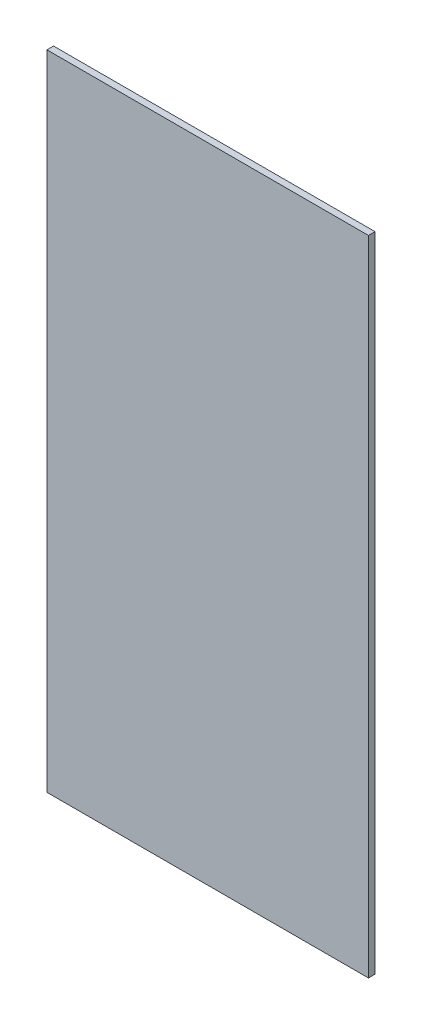
ISO-10303-21;
HEADER;
FILE_DESCRIPTION(('STEP AP214'),'2;1');
FILE_NAME('part.step','',(''),(''),'','','');
FILE_SCHEMA(('AUTOMOTIVE_DESIGN { 1 0 10303 214 1 1 1 1 }'));
ENDSEC;
DATA;
#1=APPLICATION_CONTEXT('core data for automotive mechanical design processes');
#2=APPLICATION_PROTOCOL_DEFINITION('international standard','automotive_design',2000,#1);
#3=PRODUCT_CONTEXT('',#1,'mechanical');
#4=PRODUCT('Part','Part','',(#3));
#5=PRODUCT_RELATED_PRODUCT_CATEGORY('part','',(#4));
#6=PRODUCT_DEFINITION_FORMATION('','',#4);
#7=PRODUCT_DEFINITION_CONTEXT('part definition',#1,'design');
#8=PRODUCT_DEFINITION('design','',#6,#7);
#9=PRODUCT_DEFINITION_SHAPE('','',#8);
#10=(LENGTH_UNIT() NAMED_UNIT(*) SI_UNIT(.MILLI.,.METRE.));
#11=(NAMED_UNIT(*) PLANE_ANGLE_UNIT() SI_UNIT($,.RADIAN.));
#12=(NAMED_UNIT(*) SI_UNIT($,.STERADIAN.) SOLID_ANGLE_UNIT());
#13=UNCERTAINTY_MEASURE_WITH_UNIT(LENGTH_MEASURE(1.E-05),#10,'distance_accuracy_value','');
#14=(GEOMETRIC_REPRESENTATION_CONTEXT(3) GLOBAL_UNCERTAINTY_ASSIGNED_CONTEXT((#13)) GLOBAL_UNIT_ASSIGNED_CONTEXT((#10,
#11,#12)) REPRESENTATION_CONTEXT('',''));
#15=CARTESIAN_POINT('',(0.,0.,0.));
#16=DIRECTION('',(0.,0.,1.));
#17=DIRECTION('',(1.,0.,0.));
#18=AXIS2_PLACEMENT_3D('',#15,#16,#17);
#19=CARTESIAN_POINT('',(304.8,609.6,12.5));
#20=DIRECTION('',(-1.,0.,0.));
#21=DIRECTION('',(0.,-1.,0.));
#22=AXIS2_PLACEMENT_3D('',#19,#20,#21);
#23=PLANE('',#22);
#24=DIRECTION('',(0.,1.,0.));
#25=VECTOR('',#24,1.);
#26=CARTESIAN_POINT('',(304.8,609.6,0.));
#27=LINE('',#26,#25);
#28=CARTESIAN_POINT('',(304.8,-609.6,0.));
#29=VERTEX_POINT('',#28);
#30=CARTESIAN_POINT('',(304.8,609.6,0.));
#31=VERTEX_POINT('',#30);
#32=EDGE_CURVE('E96',#29,#31,#27,.T.);
#33=ORIENTED_EDGE('',*,*,#32,.T.);
#34=DIRECTION('',(0.,0.,-1.));
#35=VECTOR('',#34,1.);
#36=CARTESIAN_POINT('',(304.8,609.6,12.5));
#37=LINE('',#36,#35);
#38=CARTESIAN_POINT('',(304.8,609.6,12.5));
#39=VERTEX_POINT('',#38);
#40=EDGE_CURVE('E11',#39,#31,#37,.T.);
#41=ORIENTED_EDGE('',*,*,#40,.F.);
#42=DIRECTION('',(0.,1.,0.));
#43=VECTOR('',#42,1.);
#44=CARTESIAN_POINT('',(304.8,609.6,12.5));
#45=LINE('',#44,#43);
#46=CARTESIAN_POINT('',(304.8,-609.6,12.5));
#47=VERTEX_POINT('',#46);
#48=EDGE_CURVE('E84',#47,#39,#45,.T.);
#49=ORIENTED_EDGE('',*,*,#48,.F.);
#50=DIRECTION('',(0.,0.,-1.));
#51=VECTOR('',#50,1.);
#52=CARTESIAN_POINT('',(304.8,-609.6,12.5));
#53=LINE('',#52,#51);
#54=EDGE_CURVE('E92',#47,#29,#53,.T.);
#55=ORIENTED_EDGE('',*,*,#54,.T.);
#56=EDGE_LOOP('',(#33,#41,#49,#55));
#57=FACE_BOUND('',#56,.T.);
#58=ADVANCED_FACE('F33',(#57),#23,.F.);
#59=CARTESIAN_POINT('',(-304.8,609.6,12.5));
#60=DIRECTION('',(0.,-1.,0.));
#61=DIRECTION('',(0.,0.,-1.));
#62=AXIS2_PLACEMENT_3D('',#59,#60,#61);
#63=PLANE('',#62);
#64=DIRECTION('',(-1.,0.,0.));
#65=VECTOR('',#64,1.);
#66=CARTESIAN_POINT('',(-304.8,609.6,0.));
#67=LINE('',#66,#65);
#68=CARTESIAN_POINT('',(-304.8,609.6,0.));
#69=VERTEX_POINT('',#68);
#70=EDGE_CURVE('E88',#31,#69,#67,.T.);
#71=ORIENTED_EDGE('',*,*,#70,.T.);
#72=DIRECTION('',(0.,0.,-1.));
#73=VECTOR('',#72,1.);
#74=CARTESIAN_POINT('',(-304.8,609.6,12.5));
#75=LINE('',#74,#73);
#76=CARTESIAN_POINT('',(-304.8,609.6,12.5));
#77=VERTEX_POINT('',#76);
#78=EDGE_CURVE('E41',#77,#69,#75,.T.);
#79=ORIENTED_EDGE('',*,*,#78,.F.);
#80=DIRECTION('',(-1.,0.,0.));
#81=VECTOR('',#80,1.);
#82=CARTESIAN_POINT('',(-304.8,609.6,12.5));
#83=LINE('',#82,#81);
#84=EDGE_CURVE('E79',#39,#77,#83,.T.);
#85=ORIENTED_EDGE('',*,*,#84,.F.);
#86=ORIENTED_EDGE('',*,*,#40,.T.);
#87=EDGE_LOOP('',(#71,#79,#85,#86));
#88=FACE_BOUND('',#87,.T.);
#89=ADVANCED_FACE('F87',(#88),#63,.F.);
#90=CARTESIAN_POINT('',(-304.8,609.6,12.5));
#91=DIRECTION('',(1.,0.,0.));
#92=DIRECTION('',(0.,1.,0.));
#93=AXIS2_PLACEMENT_3D('',#90,#91,#92);
#94=PLANE('',#93);
#95=DIRECTION('',(0.,-1.,0.));
#96=VECTOR('',#95,1.);
#97=CARTESIAN_POINT('',(-304.8,609.6,0.));
#98=LINE('',#97,#96);
#99=CARTESIAN_POINT('',(-304.8,-609.6,0.));
#100=VERTEX_POINT('',#99);
#101=EDGE_CURVE('E66',#69,#100,#98,.T.);
#102=ORIENTED_EDGE('',*,*,#101,.T.);
#103=DIRECTION('',(0.,0.,-1.));
#104=VECTOR('',#103,1.);
#105=CARTESIAN_POINT('',(-304.8,-609.6,12.5));
#106=LINE('',#105,#104);
#107=CARTESIAN_POINT('',(-304.8,-609.6,12.5));
#108=VERTEX_POINT('',#107);
#109=EDGE_CURVE('E89',#108,#100,#106,.T.);
#110=ORIENTED_EDGE('',*,*,#109,.F.);
#111=DIRECTION('',(0.,-1.,0.));
#112=VECTOR('',#111,1.);
#113=CARTESIAN_POINT('',(-304.8,609.6,12.5));
#114=LINE('',#113,#112);
#115=EDGE_CURVE('E82',#77,#108,#114,.T.);
#116=ORIENTED_EDGE('',*,*,#115,.F.);
#117=ORIENTED_EDGE('',*,*,#78,.T.);
#118=EDGE_LOOP('',(#102,#110,#116,#117));
#119=FACE_BOUND('',#118,.T.);
#120=ADVANCED_FACE('F90',(#119),#94,.F.);
#121=CARTESIAN_POINT('',(-304.8,-609.6,12.5));
#122=DIRECTION('',(0.,1.,0.));
#123=DIRECTION('',(0.,0.,1.));
#124=AXIS2_PLACEMENT_3D('',#121,#122,#123);
#125=PLANE('',#124);
#126=DIRECTION('',(1.,0.,0.));
#127=VECTOR('',#126,1.);
#128=CARTESIAN_POINT('',(-304.8,-609.6,0.));
#129=LINE('',#128,#127);
#130=EDGE_CURVE('E72',#100,#29,#129,.T.);
#131=ORIENTED_EDGE('',*,*,#130,.T.);
#132=ORIENTED_EDGE('',*,*,#54,.F.);
#133=DIRECTION('',(1.,0.,0.));
#134=VECTOR('',#133,1.);
#135=CARTESIAN_POINT('',(-304.8,-609.6,12.5));
#136=LINE('',#135,#134);
#137=EDGE_CURVE('E49',#108,#47,#136,.T.);
#138=ORIENTED_EDGE('',*,*,#137,.F.);
#139=ORIENTED_EDGE('',*,*,#109,.T.);
#140=EDGE_LOOP('',(#131,#132,#138,#139));
#141=FACE_BOUND('',#140,.T.);
#142=ADVANCED_FACE('F103',(#141),#125,.F.);
#143=CARTESIAN_POINT('',(0.,0.,12.5));
#144=DIRECTION('',(0.,0.,1.));
#145=DIRECTION('',(1.,0.,0.));
#146=AXIS2_PLACEMENT_3D('',#143,#144,#145);
#147=PLANE('',#146);
#148=ORIENTED_EDGE('',*,*,#48,.T.);
#149=ORIENTED_EDGE('',*,*,#84,.T.);
#150=ORIENTED_EDGE('',*,*,#115,.T.);
#151=ORIENTED_EDGE('',*,*,#137,.T.);
#152=EDGE_LOOP('',(#148,#149,#150,#151));
#153=FACE_BOUND('',#152,.T.);
#154=ADVANCED_FACE('F80',(#153),#147,.T.);
#155=CARTESIAN_POINT('',(0.,0.,0.));
#156=DIRECTION('',(0.,0.,1.));
#157=DIRECTION('',(1.,0.,0.));
#158=AXIS2_PLACEMENT_3D('',#155,#156,#157);
#159=PLANE('',#158);
#160=ORIENTED_EDGE('',*,*,#32,.F.);
#161=ORIENTED_EDGE('',*,*,#130,.F.);
#162=ORIENTED_EDGE('',*,*,#101,.F.);
#163=ORIENTED_EDGE('',*,*,#70,.F.);
#164=EDGE_LOOP('',(#160,#161,#162,#163));
#165=FACE_BOUND('',#164,.T.);
#166=ADVANCED_FACE('F106',(#165),#159,.F.);
#167=CLOSED_SHELL('',(#58,#89,#120,#142,#154,#166));
#168=MANIFOLD_SOLID_BREP('B2',#167);
#169=ADVANCED_BREP_SHAPE_REPRESENTATION('',(#18,#168),#14);
#170=SHAPE_DEFINITION_REPRESENTATION(#9,#169);
ENDSEC;
END-ISO-10303-21;
